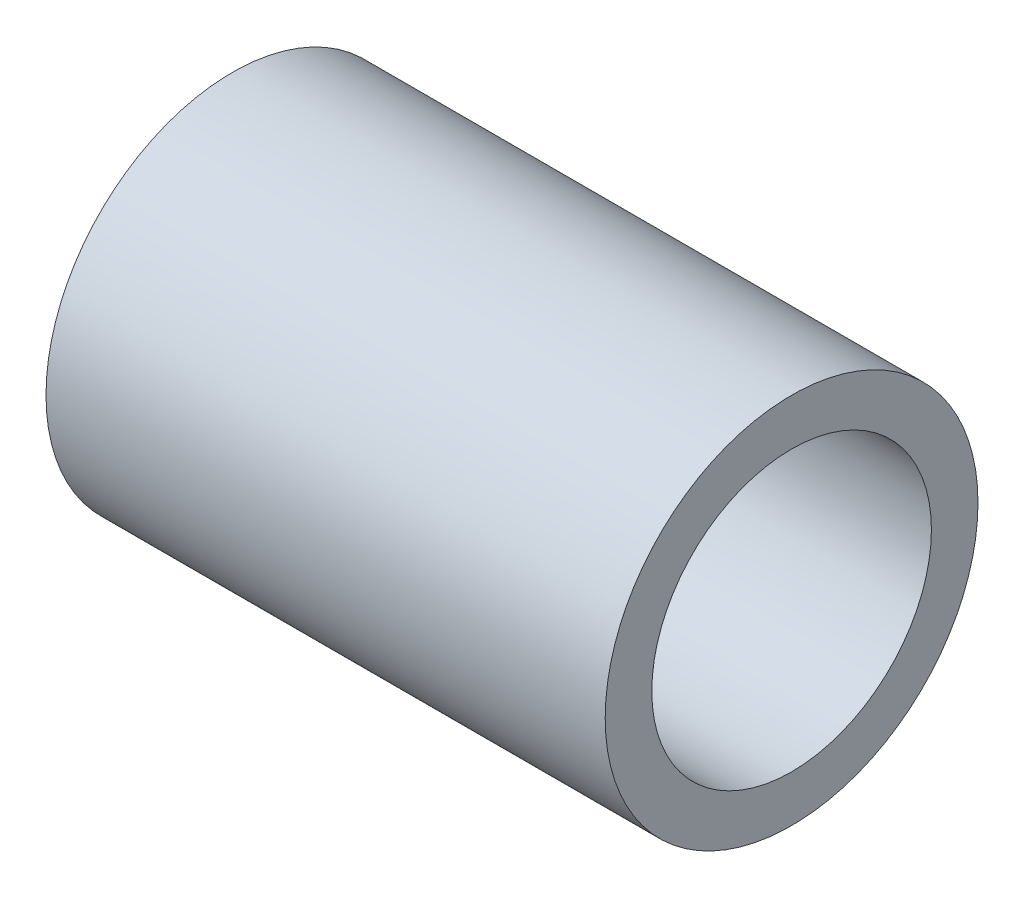
ISO-10303-21;
HEADER;
FILE_DESCRIPTION(('STEP AP214'),'2;1');
FILE_NAME('part.step','',(''),(''),'','','');
FILE_SCHEMA(('AUTOMOTIVE_DESIGN { 1 0 10303 214 1 1 1 1 }'));
ENDSEC;
DATA;
#1=APPLICATION_CONTEXT('core data for automotive mechanical design processes');
#2=APPLICATION_PROTOCOL_DEFINITION('international standard','automotive_design',2000,#1);
#3=PRODUCT_CONTEXT('',#1,'mechanical');
#4=PRODUCT('Part','Part','',(#3));
#5=PRODUCT_RELATED_PRODUCT_CATEGORY('part','',(#4));
#6=PRODUCT_DEFINITION_FORMATION('','',#4);
#7=PRODUCT_DEFINITION_CONTEXT('part definition',#1,'design');
#8=PRODUCT_DEFINITION('design','',#6,#7);
#9=PRODUCT_DEFINITION_SHAPE('','',#8);
#10=(LENGTH_UNIT() NAMED_UNIT(*) SI_UNIT(.MILLI.,.METRE.));
#11=(NAMED_UNIT(*) PLANE_ANGLE_UNIT() SI_UNIT($,.RADIAN.));
#12=(NAMED_UNIT(*) SI_UNIT($,.STERADIAN.) SOLID_ANGLE_UNIT());
#13=UNCERTAINTY_MEASURE_WITH_UNIT(LENGTH_MEASURE(1.E-05),#10,'distance_accuracy_value','');
#14=(GEOMETRIC_REPRESENTATION_CONTEXT(3) GLOBAL_UNCERTAINTY_ASSIGNED_CONTEXT((#13)) GLOBAL_UNIT_ASSIGNED_CONTEXT((#10,
#11,#12)) REPRESENTATION_CONTEXT('',''));
#15=CARTESIAN_POINT('',(0.,0.,0.));
#16=DIRECTION('',(0.,0.,1.));
#17=DIRECTION('',(1.,0.,0.));
#18=AXIS2_PLACEMENT_3D('',#15,#16,#17);
#19=CARTESIAN_POINT('',(0.,0.,0.));
#20=DIRECTION('',(1.,0.,0.));
#21=DIRECTION('',(0.,0.,-1.));
#22=AXIS2_PLACEMENT_3D('',#19,#20,#21);
#23=PLANE('',#22);
#24=CARTESIAN_POINT('',(0.,0.,0.));
#25=DIRECTION('',(-1.,0.,0.));
#26=DIRECTION('',(0.,0.,1.));
#27=AXIS2_PLACEMENT_3D('',#24,#25,#26);
#28=CIRCLE('',#27,4.);
#29=CARTESIAN_POINT('',(0.,0.,4.));
#30=VERTEX_POINT('',#29);
#31=EDGE_CURVE('E88',#30,#30,#28,.T.);
#32=ORIENTED_EDGE('',*,*,#31,.T.);
#33=EDGE_LOOP('',(#32));
#34=FACE_BOUND('',#33,.T.);
#35=CARTESIAN_POINT('',(0.,0.,0.));
#36=DIRECTION('',(1.,0.,0.));
#37=DIRECTION('',(0.,0.,-1.));
#38=AXIS2_PLACEMENT_3D('',#35,#36,#37);
#39=CIRCLE('',#38,3.);
#40=CARTESIAN_POINT('',(0.,0.,-3.));
#41=VERTEX_POINT('',#40);
#42=EDGE_CURVE('E49',#41,#41,#39,.F.);
#43=ORIENTED_EDGE('',*,*,#42,.F.);
#44=EDGE_LOOP('',(#43));
#45=FACE_BOUND('',#44,.T.);
#46=ADVANCED_FACE('F74',(#34,#45),#23,.F.);
#47=CARTESIAN_POINT('',(12.,0.,0.));
#48=DIRECTION('',(-1.,0.,0.));
#49=DIRECTION('',(0.,0.,1.));
#50=AXIS2_PLACEMENT_3D('',#47,#48,#49);
#51=PLANE('',#50);
#52=CARTESIAN_POINT('',(12.,0.,0.));
#53=DIRECTION('',(-1.,0.,0.));
#54=DIRECTION('',(0.,0.,1.));
#55=AXIS2_PLACEMENT_3D('',#52,#53,#54);
#56=CIRCLE('',#55,4.);
#57=CARTESIAN_POINT('',(12.,0.,4.));
#58=VERTEX_POINT('',#57);
#59=EDGE_CURVE('E94',#58,#58,#56,.T.);
#60=ORIENTED_EDGE('',*,*,#59,.F.);
#61=EDGE_LOOP('',(#60));
#62=FACE_BOUND('',#61,.T.);
#63=CARTESIAN_POINT('',(12.,0.,0.));
#64=DIRECTION('',(-1.,0.,0.));
#65=DIRECTION('',(0.,0.,1.));
#66=AXIS2_PLACEMENT_3D('',#63,#64,#65);
#67=CIRCLE('',#66,3.);
#68=CARTESIAN_POINT('',(12.,0.,3.));
#69=VERTEX_POINT('',#68);
#70=EDGE_CURVE('E81',#69,#69,#67,.F.);
#71=ORIENTED_EDGE('',*,*,#70,.F.);
#72=EDGE_LOOP('',(#71));
#73=FACE_BOUND('',#72,.T.);
#74=ADVANCED_FACE('F102',(#62,#73),#51,.F.);
#75=CARTESIAN_POINT('',(0.,0.,0.));
#76=DIRECTION('',(-1.,0.,0.));
#77=DIRECTION('',(0.,0.,1.));
#78=AXIS2_PLACEMENT_3D('',#75,#76,#77);
#79=CYLINDRICAL_SURFACE('',#78,4.);
#80=ORIENTED_EDGE('',*,*,#31,.F.);
#81=EDGE_LOOP('',(#80));
#82=FACE_BOUND('',#81,.T.);
#83=ORIENTED_EDGE('',*,*,#59,.T.);
#84=EDGE_LOOP('',(#83));
#85=FACE_BOUND('',#84,.T.);
#86=ADVANCED_FACE('F100',(#82,#85),#79,.T.);
#87=CARTESIAN_POINT('',(0.,0.,0.));
#88=DIRECTION('',(1.,0.,0.));
#89=DIRECTION('',(0.,0.,-1.));
#90=AXIS2_PLACEMENT_3D('',#87,#88,#89);
#91=CYLINDRICAL_SURFACE('',#90,3.);
#92=ORIENTED_EDGE('',*,*,#70,.T.);
#93=EDGE_LOOP('',(#92));
#94=FACE_BOUND('',#93,.T.);
#95=ORIENTED_EDGE('',*,*,#42,.T.);
#96=EDGE_LOOP('',(#95));
#97=FACE_BOUND('',#96,.T.);
#98=ADVANCED_FACE('F110',(#94,#97),#91,.F.);
#99=CLOSED_SHELL('',(#46,#74,#86,#98));
#100=MANIFOLD_SOLID_BREP('B6',#99);
#101=ADVANCED_BREP_SHAPE_REPRESENTATION('',(#18,#100),#14);
#102=SHAPE_DEFINITION_REPRESENTATION(#9,#101);
ENDSEC;
END-ISO-10303-21;
